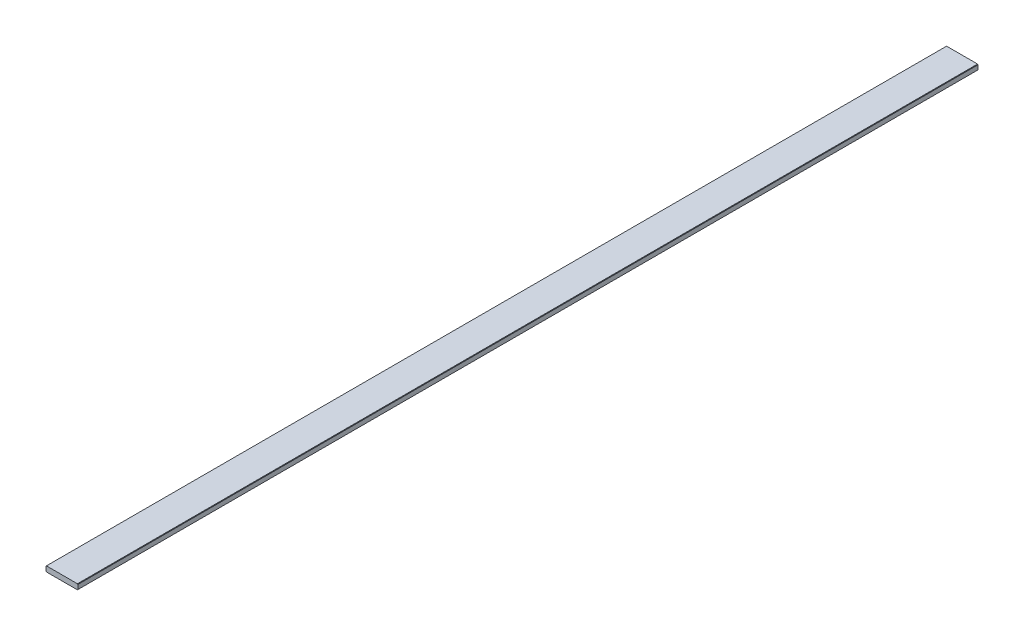
ISO-10303-21;
HEADER;
FILE_DESCRIPTION(('STEP AP214'),'2;1');
FILE_NAME('part.step','',(''),(''),'','','');
FILE_SCHEMA(('AUTOMOTIVE_DESIGN { 1 0 10303 214 1 1 1 1 }'));
ENDSEC;
DATA;
#1=APPLICATION_CONTEXT('core data for automotive mechanical design processes');
#2=APPLICATION_PROTOCOL_DEFINITION('international standard','automotive_design',2000,#1);
#3=PRODUCT_CONTEXT('',#1,'mechanical');
#4=PRODUCT('Part','Part','',(#3));
#5=PRODUCT_RELATED_PRODUCT_CATEGORY('part','',(#4));
#6=PRODUCT_DEFINITION_FORMATION('','',#4);
#7=PRODUCT_DEFINITION_CONTEXT('part definition',#1,'design');
#8=PRODUCT_DEFINITION('design','',#6,#7);
#9=PRODUCT_DEFINITION_SHAPE('','',#8);
#10=(LENGTH_UNIT() NAMED_UNIT(*) SI_UNIT(.MILLI.,.METRE.));
#11=(NAMED_UNIT(*) PLANE_ANGLE_UNIT() SI_UNIT($,.RADIAN.));
#12=(NAMED_UNIT(*) SI_UNIT($,.STERADIAN.) SOLID_ANGLE_UNIT());
#13=UNCERTAINTY_MEASURE_WITH_UNIT(LENGTH_MEASURE(1.E-05),#10,'distance_accuracy_value','');
#14=(GEOMETRIC_REPRESENTATION_CONTEXT(3) GLOBAL_UNCERTAINTY_ASSIGNED_CONTEXT((#13)) GLOBAL_UNIT_ASSIGNED_CONTEXT((#10,
#11,#12)) REPRESENTATION_CONTEXT('',''));
#15=CARTESIAN_POINT('',(0.,0.,0.));
#16=DIRECTION('',(0.,0.,1.));
#17=DIRECTION('',(1.,0.,0.));
#18=AXIS2_PLACEMENT_3D('',#15,#16,#17);
#19=CARTESIAN_POINT('',(-73.,12.5,4240.));
#20=DIRECTION('',(0.,-1.,0.));
#21=DIRECTION('',(0.,0.,-1.));
#22=AXIS2_PLACEMENT_3D('',#19,#20,#21);
#23=PLANE('',#22);
#24=DIRECTION('',(-1.,0.,0.));
#25=VECTOR('',#24,1.);
#26=CARTESIAN_POINT('',(-73.,12.5,0.));
#27=LINE('',#26,#25);
#28=CARTESIAN_POINT('',(73.,12.5,0.));
#29=VERTEX_POINT('',#28);
#30=CARTESIAN_POINT('',(-73.,12.5,0.));
#31=VERTEX_POINT('',#30);
#32=EDGE_CURVE('E131',#29,#31,#27,.T.);
#33=ORIENTED_EDGE('',*,*,#32,.T.);
#34=DIRECTION('',(0.,0.,-1.));
#35=VECTOR('',#34,1.);
#36=CARTESIAN_POINT('',(-73.,12.5,4240.));
#37=LINE('',#36,#35);
#38=CARTESIAN_POINT('',(-73.,12.5,4240.));
#39=VERTEX_POINT('',#38);
#40=EDGE_CURVE('E11',#39,#31,#37,.T.);
#41=ORIENTED_EDGE('',*,*,#40,.F.);
#42=DIRECTION('',(-1.,0.,0.));
#43=VECTOR('',#42,1.);
#44=CARTESIAN_POINT('',(-73.,12.5,4240.));
#45=LINE('',#44,#43);
#46=CARTESIAN_POINT('',(73.,12.5,4240.));
#47=VERTEX_POINT('',#46);
#48=EDGE_CURVE('E145',#47,#39,#45,.T.);
#49=ORIENTED_EDGE('',*,*,#48,.F.);
#50=DIRECTION('',(0.,0.,-1.));
#51=VECTOR('',#50,1.);
#52=CARTESIAN_POINT('',(73.,12.5,4240.));
#53=LINE('',#52,#51);
#54=EDGE_CURVE('E127',#47,#29,#53,.T.);
#55=ORIENTED_EDGE('',*,*,#54,.T.);
#56=EDGE_LOOP('',(#33,#41,#49,#55));
#57=FACE_BOUND('',#56,.T.);
#58=ADVANCED_FACE('F35',(#57),#23,.F.);
#59=CARTESIAN_POINT('',(-75.,10.5,4240.));
#60=DIRECTION('',(0.707106781186547,-0.707106781186548,0.));
#61=DIRECTION('',(0.707106781186548,0.707106781186547,0.));
#62=AXIS2_PLACEMENT_3D('',#59,#60,#61);
#63=PLANE('',#62);
#64=DIRECTION('',(-0.707106781186548,-0.707106781186547,0.));
#65=VECTOR('',#64,1.);
#66=CARTESIAN_POINT('',(-75.,10.5,0.));
#67=LINE('',#66,#65);
#68=CARTESIAN_POINT('',(-75.,10.5,0.));
#69=VERTEX_POINT('',#68);
#70=EDGE_CURVE('E134',#31,#69,#67,.T.);
#71=ORIENTED_EDGE('',*,*,#70,.T.);
#72=DIRECTION('',(0.,0.,-1.));
#73=VECTOR('',#72,1.);
#74=CARTESIAN_POINT('',(-75.,10.5,4240.));
#75=LINE('',#74,#73);
#76=CARTESIAN_POINT('',(-75.,10.5,4240.));
#77=VERTEX_POINT('',#76);
#78=EDGE_CURVE('E43',#77,#69,#75,.T.);
#79=ORIENTED_EDGE('',*,*,#78,.F.);
#80=DIRECTION('',(-0.707106781186548,-0.707106781186547,0.));
#81=VECTOR('',#80,1.);
#82=CARTESIAN_POINT('',(-75.,10.5,4240.));
#83=LINE('',#82,#81);
#84=EDGE_CURVE('E94',#39,#77,#83,.T.);
#85=ORIENTED_EDGE('',*,*,#84,.F.);
#86=ORIENTED_EDGE('',*,*,#40,.T.);
#87=EDGE_LOOP('',(#71,#79,#85,#86));
#88=FACE_BOUND('',#87,.T.);
#89=ADVANCED_FACE('F180',(#88),#63,.F.);
#90=CARTESIAN_POINT('',(-75.,10.5,4240.));
#91=DIRECTION('',(1.,0.,0.));
#92=DIRECTION('',(0.,0.,-1.));
#93=AXIS2_PLACEMENT_3D('',#90,#91,#92);
#94=PLANE('',#93);
#95=DIRECTION('',(0.,-1.,0.));
#96=VECTOR('',#95,1.);
#97=CARTESIAN_POINT('',(-75.,10.5,0.));
#98=LINE('',#97,#96);
#99=CARTESIAN_POINT('',(-75.,-10.5,0.));
#100=VERTEX_POINT('',#99);
#101=EDGE_CURVE('E136',#69,#100,#98,.T.);
#102=ORIENTED_EDGE('',*,*,#101,.T.);
#103=DIRECTION('',(0.,0.,-1.));
#104=VECTOR('',#103,1.);
#105=CARTESIAN_POINT('',(-75.,-10.5,4240.));
#106=LINE('',#105,#104);
#107=CARTESIAN_POINT('',(-75.,-10.5,4240.));
#108=VERTEX_POINT('',#107);
#109=EDGE_CURVE('E152',#108,#100,#106,.T.);
#110=ORIENTED_EDGE('',*,*,#109,.F.);
#111=DIRECTION('',(0.,-1.,0.));
#112=VECTOR('',#111,1.);
#113=CARTESIAN_POINT('',(-75.,10.5,4240.));
#114=LINE('',#113,#112);
#115=EDGE_CURVE('E160',#77,#108,#114,.T.);
#116=ORIENTED_EDGE('',*,*,#115,.F.);
#117=ORIENTED_EDGE('',*,*,#78,.T.);
#118=EDGE_LOOP('',(#102,#110,#116,#117));
#119=FACE_BOUND('',#118,.T.);
#120=ADVANCED_FACE('F158',(#119),#94,.F.);
#121=CARTESIAN_POINT('',(-75.,-10.5,4240.));
#122=DIRECTION('',(0.707106781186547,0.707106781186548,0.));
#123=DIRECTION('',(-0.707106781186548,0.707106781186547,0.));
#124=AXIS2_PLACEMENT_3D('',#121,#122,#123);
#125=PLANE('',#124);
#126=DIRECTION('',(0.707106781186548,-0.707106781186547,0.));
#127=VECTOR('',#126,1.);
#128=CARTESIAN_POINT('',(-75.,-10.5,0.));
#129=LINE('',#128,#127);
#130=CARTESIAN_POINT('',(-73.,-12.5,0.));
#131=VERTEX_POINT('',#130);
#132=EDGE_CURVE('E138',#100,#131,#129,.T.);
#133=ORIENTED_EDGE('',*,*,#132,.T.);
#134=DIRECTION('',(0.,0.,-1.));
#135=VECTOR('',#134,1.);
#136=CARTESIAN_POINT('',(-73.,-12.5,4240.));
#137=LINE('',#136,#135);
#138=CARTESIAN_POINT('',(-73.,-12.5,4240.));
#139=VERTEX_POINT('',#138);
#140=EDGE_CURVE('E149',#139,#131,#137,.T.);
#141=ORIENTED_EDGE('',*,*,#140,.F.);
#142=DIRECTION('',(0.707106781186548,-0.707106781186547,0.));
#143=VECTOR('',#142,1.);
#144=CARTESIAN_POINT('',(-75.,-10.5,4240.));
#145=LINE('',#144,#143);
#146=EDGE_CURVE('E172',#108,#139,#145,.T.);
#147=ORIENTED_EDGE('',*,*,#146,.F.);
#148=ORIENTED_EDGE('',*,*,#109,.T.);
#149=EDGE_LOOP('',(#133,#141,#147,#148));
#150=FACE_BOUND('',#149,.T.);
#151=ADVANCED_FACE('F168',(#150),#125,.F.);
#152=CARTESIAN_POINT('',(-73.,-12.5,4240.));
#153=DIRECTION('',(0.,1.,0.));
#154=DIRECTION('',(0.,0.,1.));
#155=AXIS2_PLACEMENT_3D('',#152,#153,#154);
#156=PLANE('',#155);
#157=DIRECTION('',(1.,0.,0.));
#158=VECTOR('',#157,1.);
#159=CARTESIAN_POINT('',(-73.,-12.5,0.));
#160=LINE('',#159,#158);
#161=CARTESIAN_POINT('',(73.,-12.5,0.));
#162=VERTEX_POINT('',#161);
#163=EDGE_CURVE('E140',#131,#162,#160,.T.);
#164=ORIENTED_EDGE('',*,*,#163,.T.);
#165=DIRECTION('',(0.,0.,-1.));
#166=VECTOR('',#165,1.);
#167=CARTESIAN_POINT('',(73.,-12.5,4240.));
#168=LINE('',#167,#166);
#169=CARTESIAN_POINT('',(73.,-12.5,4240.));
#170=VERTEX_POINT('',#169);
#171=EDGE_CURVE('E122',#170,#162,#168,.T.);
#172=ORIENTED_EDGE('',*,*,#171,.F.);
#173=DIRECTION('',(1.,0.,0.));
#174=VECTOR('',#173,1.);
#175=CARTESIAN_POINT('',(-73.,-12.5,4240.));
#176=LINE('',#175,#174);
#177=EDGE_CURVE('E113',#139,#170,#176,.T.);
#178=ORIENTED_EDGE('',*,*,#177,.F.);
#179=ORIENTED_EDGE('',*,*,#140,.T.);
#180=EDGE_LOOP('',(#164,#172,#178,#179));
#181=FACE_BOUND('',#180,.T.);
#182=ADVANCED_FACE('F171',(#181),#156,.F.);
#183=CARTESIAN_POINT('',(73.,-12.5,4240.));
#184=DIRECTION('',(-0.707106781186547,0.707106781186548,0.));
#185=DIRECTION('',(-0.707106781186548,-0.707106781186547,0.));
#186=AXIS2_PLACEMENT_3D('',#183,#184,#185);
#187=PLANE('',#186);
#188=DIRECTION('',(0.707106781186548,0.707106781186547,0.));
#189=VECTOR('',#188,1.);
#190=CARTESIAN_POINT('',(73.,-12.5,0.));
#191=LINE('',#190,#189);
#192=CARTESIAN_POINT('',(75.,-10.5,0.));
#193=VERTEX_POINT('',#192);
#194=EDGE_CURVE('E121',#162,#193,#191,.T.);
#195=ORIENTED_EDGE('',*,*,#194,.T.);
#196=DIRECTION('',(0.,0.,-1.));
#197=VECTOR('',#196,1.);
#198=CARTESIAN_POINT('',(75.,-10.5,4240.));
#199=LINE('',#198,#197);
#200=CARTESIAN_POINT('',(75.,-10.5,4240.));
#201=VERTEX_POINT('',#200);
#202=EDGE_CURVE('E118',#201,#193,#199,.T.);
#203=ORIENTED_EDGE('',*,*,#202,.F.);
#204=DIRECTION('',(0.707106781186548,0.707106781186547,0.));
#205=VECTOR('',#204,1.);
#206=CARTESIAN_POINT('',(73.,-12.5,4240.));
#207=LINE('',#206,#205);
#208=EDGE_CURVE('E107',#170,#201,#207,.T.);
#209=ORIENTED_EDGE('',*,*,#208,.F.);
#210=ORIENTED_EDGE('',*,*,#171,.T.);
#211=EDGE_LOOP('',(#195,#203,#209,#210));
#212=FACE_BOUND('',#211,.T.);
#213=ADVANCED_FACE('F119',(#212),#187,.F.);
#214=CARTESIAN_POINT('',(75.,10.5,4240.));
#215=DIRECTION('',(-1.,0.,0.));
#216=DIRECTION('',(0.,0.,1.));
#217=AXIS2_PLACEMENT_3D('',#214,#215,#216);
#218=PLANE('',#217);
#219=DIRECTION('',(0.,1.,0.));
#220=VECTOR('',#219,1.);
#221=CARTESIAN_POINT('',(75.,10.5,0.));
#222=LINE('',#221,#220);
#223=CARTESIAN_POINT('',(75.,10.5,0.));
#224=VERTEX_POINT('',#223);
#225=EDGE_CURVE('E80',#193,#224,#222,.T.);
#226=ORIENTED_EDGE('',*,*,#225,.T.);
#227=DIRECTION('',(0.,0.,-1.));
#228=VECTOR('',#227,1.);
#229=CARTESIAN_POINT('',(75.,10.5,4240.));
#230=LINE('',#229,#228);
#231=CARTESIAN_POINT('',(75.,10.5,4240.));
#232=VERTEX_POINT('',#231);
#233=EDGE_CURVE('E123',#232,#224,#230,.T.);
#234=ORIENTED_EDGE('',*,*,#233,.F.);
#235=DIRECTION('',(0.,1.,0.));
#236=VECTOR('',#235,1.);
#237=CARTESIAN_POINT('',(75.,10.5,4240.));
#238=LINE('',#237,#236);
#239=EDGE_CURVE('E111',#201,#232,#238,.T.);
#240=ORIENTED_EDGE('',*,*,#239,.F.);
#241=ORIENTED_EDGE('',*,*,#202,.T.);
#242=EDGE_LOOP('',(#226,#234,#240,#241));
#243=FACE_BOUND('',#242,.T.);
#244=ADVANCED_FACE('F125',(#243),#218,.F.);
#245=CARTESIAN_POINT('',(73.,12.5,4240.));
#246=DIRECTION('',(-0.707106781186547,-0.707106781186548,0.));
#247=DIRECTION('',(0.707106781186548,-0.707106781186547,0.));
#248=AXIS2_PLACEMENT_3D('',#245,#246,#247);
#249=PLANE('',#248);
#250=DIRECTION('',(-0.707106781186548,0.707106781186547,0.));
#251=VECTOR('',#250,1.);
#252=CARTESIAN_POINT('',(73.,12.5,0.));
#253=LINE('',#252,#251);
#254=EDGE_CURVE('E86',#224,#29,#253,.T.);
#255=ORIENTED_EDGE('',*,*,#254,.T.);
#256=ORIENTED_EDGE('',*,*,#54,.F.);
#257=DIRECTION('',(-0.707106781186548,0.707106781186547,0.));
#258=VECTOR('',#257,1.);
#259=CARTESIAN_POINT('',(73.,12.5,4240.));
#260=LINE('',#259,#258);
#261=EDGE_CURVE('E51',#232,#47,#260,.T.);
#262=ORIENTED_EDGE('',*,*,#261,.F.);
#263=ORIENTED_EDGE('',*,*,#233,.T.);
#264=EDGE_LOOP('',(#255,#256,#262,#263));
#265=FACE_BOUND('',#264,.T.);
#266=ADVANCED_FACE('F196',(#265),#249,.F.);
#267=CARTESIAN_POINT('',(0.,0.,4240.));
#268=DIRECTION('',(0.,0.,-1.));
#269=DIRECTION('',(-1.,0.,0.));
#270=AXIS2_PLACEMENT_3D('',#267,#268,#269);
#271=PLANE('',#270);
#272=ORIENTED_EDGE('',*,*,#48,.T.);
#273=ORIENTED_EDGE('',*,*,#84,.T.);
#274=ORIENTED_EDGE('',*,*,#115,.T.);
#275=ORIENTED_EDGE('',*,*,#146,.T.);
#276=ORIENTED_EDGE('',*,*,#177,.T.);
#277=ORIENTED_EDGE('',*,*,#208,.T.);
#278=ORIENTED_EDGE('',*,*,#239,.T.);
#279=ORIENTED_EDGE('',*,*,#261,.T.);
#280=EDGE_LOOP('',(#272,#273,#274,#275,#276,#277,#278,#279));
#281=FACE_BOUND('',#280,.T.);
#282=ADVANCED_FACE('F109',(#281),#271,.F.);
#283=CARTESIAN_POINT('',(0.,0.,0.));
#284=DIRECTION('',(0.,0.,-1.));
#285=DIRECTION('',(-1.,0.,0.));
#286=AXIS2_PLACEMENT_3D('',#283,#284,#285);
#287=PLANE('',#286);
#288=ORIENTED_EDGE('',*,*,#32,.F.);
#289=ORIENTED_EDGE('',*,*,#254,.F.);
#290=ORIENTED_EDGE('',*,*,#225,.F.);
#291=ORIENTED_EDGE('',*,*,#194,.F.);
#292=ORIENTED_EDGE('',*,*,#163,.F.);
#293=ORIENTED_EDGE('',*,*,#132,.F.);
#294=ORIENTED_EDGE('',*,*,#101,.F.);
#295=ORIENTED_EDGE('',*,*,#70,.F.);
#296=EDGE_LOOP('',(#288,#289,#290,#291,#292,#293,#294,#295));
#297=FACE_BOUND('',#296,.T.);
#298=ADVANCED_FACE('F164',(#297),#287,.T.);
#299=CLOSED_SHELL('',(#58,#89,#120,#151,#182,#213,#244,#266,#282,#298));
#300=MANIFOLD_SOLID_BREP('B2',#299);
#301=ADVANCED_BREP_SHAPE_REPRESENTATION('',(#18,#300),#14);
#302=SHAPE_DEFINITION_REPRESENTATION(#9,#301);
ENDSEC;
END-ISO-10303-21;
